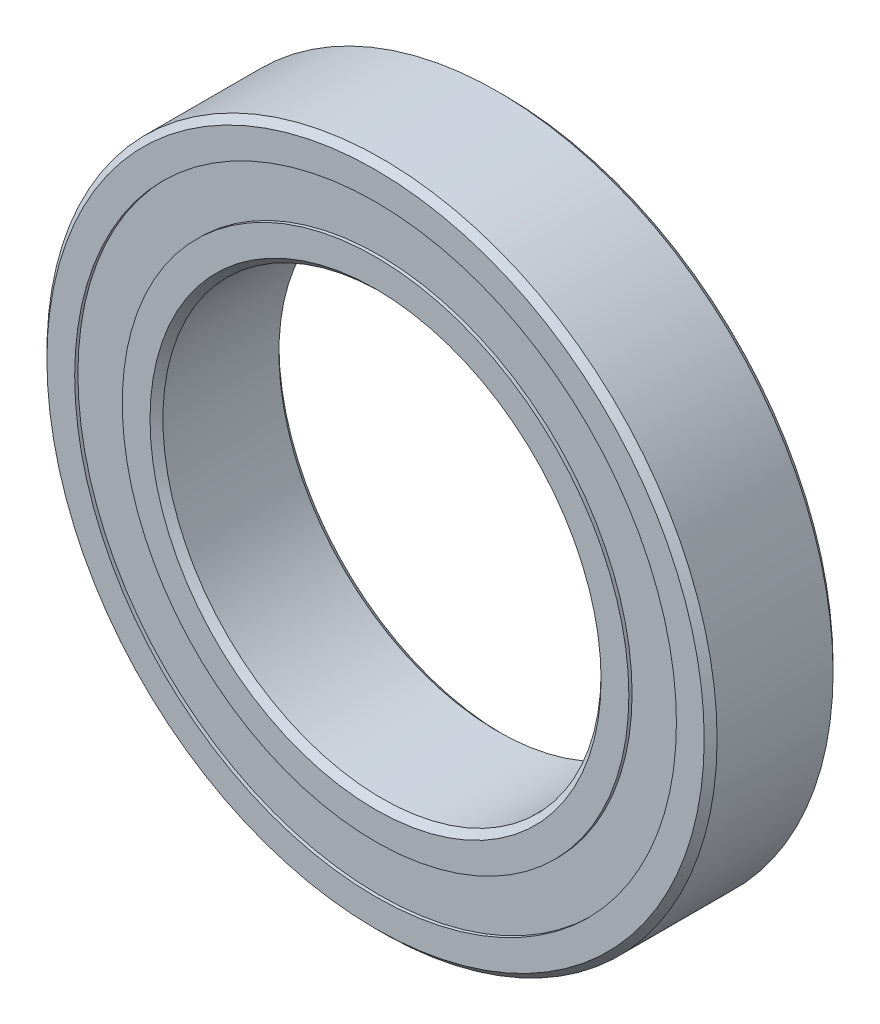
ISO-10303-21;
HEADER;
FILE_DESCRIPTION(('STEP AP214'),'2;1');
FILE_NAME('part.step','',(''),(''),'','','');
FILE_SCHEMA(('AUTOMOTIVE_DESIGN { 1 0 10303 214 1 1 1 1 }'));
ENDSEC;
DATA;
#1=APPLICATION_CONTEXT('core data for automotive mechanical design processes');
#2=APPLICATION_PROTOCOL_DEFINITION('international standard','automotive_design',2000,#1);
#3=PRODUCT_CONTEXT('',#1,'mechanical');
#4=PRODUCT('Part','Part','',(#3));
#5=PRODUCT_RELATED_PRODUCT_CATEGORY('part','',(#4));
#6=PRODUCT_DEFINITION_FORMATION('','',#4);
#7=PRODUCT_DEFINITION_CONTEXT('part definition',#1,'design');
#8=PRODUCT_DEFINITION('design','',#6,#7);
#9=PRODUCT_DEFINITION_SHAPE('','',#8);
#10=(LENGTH_UNIT() NAMED_UNIT(*) SI_UNIT(.MILLI.,.METRE.));
#11=(NAMED_UNIT(*) PLANE_ANGLE_UNIT() SI_UNIT($,.RADIAN.));
#12=(NAMED_UNIT(*) SI_UNIT($,.STERADIAN.) SOLID_ANGLE_UNIT());
#13=UNCERTAINTY_MEASURE_WITH_UNIT(LENGTH_MEASURE(1.E-05),#10,'distance_accuracy_value','');
#14=(GEOMETRIC_REPRESENTATION_CONTEXT(3) GLOBAL_UNCERTAINTY_ASSIGNED_CONTEXT((#13)) GLOBAL_UNIT_ASSIGNED_CONTEXT((#10,
#11,#12)) REPRESENTATION_CONTEXT('',''));
#15=CARTESIAN_POINT('',(0.,0.,0.));
#16=DIRECTION('',(0.,0.,1.));
#17=DIRECTION('',(1.,0.,0.));
#18=AXIS2_PLACEMENT_3D('',#15,#16,#17);
#19=CARTESIAN_POINT('',(-5.37499999999988,9.30977309068279,0.));
#20=DIRECTION('',(0.,0.,1.));
#21=DIRECTION('',(-0.499999999999989,0.866025403784445,0.));
#22=AXIS2_PLACEMENT_3D('',#19,#20,#21);
#23=SPHERICAL_SURFACE('',#22,1.44452030347508);
#24=CARTESIAN_POINT('',(-5.37499999999988,9.30977309068279,1.44452030347508));
#25=VERTEX_POINT('',#24);
#26=VERTEX_LOOP('',#25);
#27=FACE_BOUND('',#26,.T.);
#28=ADVANCED_FACE('F37',(#27),#23,.T.);
#29=CLOSED_SHELL('',(#28));
#30=MANIFOLD_SOLID_BREP('B2',#29);
#31=CARTESIAN_POINT('',(-9.30977309068265,5.37500000000011,0.));
#32=DIRECTION('',(0.,0.,1.));
#33=DIRECTION('',(-0.866025403784433,0.50000000000001,0.));
#34=AXIS2_PLACEMENT_3D('',#31,#32,#33);
#35=SPHERICAL_SURFACE('',#34,1.44452030347508);
#36=CARTESIAN_POINT('',(-9.30977309068265,5.37500000000011,1.44452030347508));
#37=VERTEX_POINT('',#36);
#38=VERTEX_LOOP('',#37);
#39=FACE_BOUND('',#38,.T.);
#40=ADVANCED_FACE('F57',(#39),#35,.T.);
#41=CLOSED_SHELL('',(#40));
#42=MANIFOLD_SOLID_BREP('B6',#41);
#43=CARTESIAN_POINT('',(-10.75,1.12600273177691E-13,0.));
#44=DIRECTION('',(0.,0.,1.));
#45=DIRECTION('',(-1.,0.,0.));
#46=AXIS2_PLACEMENT_3D('',#43,#44,#45);
#47=SPHERICAL_SURFACE('',#46,1.44452030347508);
#48=CARTESIAN_POINT('',(-10.75,1.12600273177691E-13,1.44452030347508));
#49=VERTEX_POINT('',#48);
#50=VERTEX_LOOP('',#49);
#51=FACE_BOUND('',#50,.T.);
#52=ADVANCED_FACE('F77',(#51),#47,.T.);
#53=CLOSED_SHELL('',(#52));
#54=MANIFOLD_SOLID_BREP('B33',#53);
#55=CARTESIAN_POINT('',(-9.30977309068277,-5.37499999999991,0.));
#56=DIRECTION('',(0.,0.,1.));
#57=DIRECTION('',(-0.866025403784443,-0.499999999999992,0.));
#58=AXIS2_PLACEMENT_3D('',#55,#56,#57);
#59=SPHERICAL_SURFACE('',#58,1.44452030347508);
#60=CARTESIAN_POINT('',(-9.30977309068277,-5.37499999999991,1.44452030347508));
#61=VERTEX_POINT('',#60);
#62=VERTEX_LOOP('',#61);
#63=FACE_BOUND('',#62,.T.);
#64=ADVANCED_FACE('F97',(#63),#59,.T.);
#65=CLOSED_SHELL('',(#64));
#66=MANIFOLD_SOLID_BREP('B53',#65);
#67=CARTESIAN_POINT('',(-5.37500000000008,-9.30977309068267,0.));
#68=DIRECTION('',(0.,0.,1.));
#69=DIRECTION('',(-0.500000000000007,-0.866025403784435,0.));
#70=AXIS2_PLACEMENT_3D('',#67,#68,#69);
#71=SPHERICAL_SURFACE('',#70,1.44452030347508);
#72=CARTESIAN_POINT('',(-5.37500000000008,-9.30977309068267,1.44452030347508));
#73=VERTEX_POINT('',#72);
#74=VERTEX_LOOP('',#73);
#75=FACE_BOUND('',#74,.T.);
#76=ADVANCED_FACE('F117',(#75),#71,.T.);
#77=CLOSED_SHELL('',(#76));
#78=MANIFOLD_SOLID_BREP('B73',#77);
#79=CARTESIAN_POINT('',(0.,-10.75,0.));
#80=DIRECTION('',(0.,0.,1.));
#81=DIRECTION('',(0.,-1.,0.));
#82=AXIS2_PLACEMENT_3D('',#79,#80,#81);
#83=SPHERICAL_SURFACE('',#82,1.44452030347508);
#84=CARTESIAN_POINT('',(0.,-10.75,1.44452030347508));
#85=VERTEX_POINT('',#84);
#86=VERTEX_LOOP('',#85);
#87=FACE_BOUND('',#86,.T.);
#88=ADVANCED_FACE('F137',(#87),#83,.T.);
#89=CLOSED_SHELL('',(#88));
#90=MANIFOLD_SOLID_BREP('B93',#89);
#91=CARTESIAN_POINT('',(5.37499999999995,-9.30977309068275,0.));
#92=DIRECTION('',(0.,0.,1.));
#93=DIRECTION('',(0.499999999999995,-0.866025403784442,0.));
#94=AXIS2_PLACEMENT_3D('',#91,#92,#93);
#95=SPHERICAL_SURFACE('',#94,1.44452030347508);
#96=CARTESIAN_POINT('',(5.37499999999995,-9.30977309068275,1.44452030347508));
#97=VERTEX_POINT('',#96);
#98=VERTEX_LOOP('',#97);
#99=FACE_BOUND('',#98,.T.);
#100=ADVANCED_FACE('F157',(#99),#95,.T.);
#101=CLOSED_SHELL('',(#100));
#102=MANIFOLD_SOLID_BREP('B113',#101);
#103=CARTESIAN_POINT('',(9.30977309068269,-5.37500000000005,0.));
#104=DIRECTION('',(0.,0.,1.));
#105=DIRECTION('',(0.866025403784436,-0.500000000000004,0.));
#106=AXIS2_PLACEMENT_3D('',#103,#104,#105);
#107=SPHERICAL_SURFACE('',#106,1.44452030347508);
#108=CARTESIAN_POINT('',(9.30977309068269,-5.37500000000005,1.44452030347508));
#109=VERTEX_POINT('',#108);
#110=VERTEX_LOOP('',#109);
#111=FACE_BOUND('',#110,.T.);
#112=ADVANCED_FACE('F177',(#111),#107,.T.);
#113=CLOSED_SHELL('',(#112));
#114=MANIFOLD_SOLID_BREP('B133',#113);
#115=CARTESIAN_POINT('',(10.75,0.,0.));
#116=DIRECTION('',(0.,0.,1.));
#117=DIRECTION('',(1.,0.,0.));
#118=AXIS2_PLACEMENT_3D('',#115,#116,#117);
#119=SPHERICAL_SURFACE('',#118,1.44452030347508);
#120=CARTESIAN_POINT('',(10.75,0.,1.44452030347508));
#121=VERTEX_POINT('',#120);
#122=VERTEX_LOOP('',#121);
#123=FACE_BOUND('',#122,.T.);
#124=ADVANCED_FACE('F197',(#123),#119,.T.);
#125=CLOSED_SHELL('',(#124));
#126=MANIFOLD_SOLID_BREP('B153',#125);
#127=CARTESIAN_POINT('',(9.30977309068273,5.37499999999998,0.));
#128=DIRECTION('',(0.,0.,1.));
#129=DIRECTION('',(0.86602540378444,0.499999999999998,0.));
#130=AXIS2_PLACEMENT_3D('',#127,#128,#129);
#131=SPHERICAL_SURFACE('',#130,1.44452030347508);
#132=CARTESIAN_POINT('',(9.30977309068273,5.37499999999998,1.44452030347508));
#133=VERTEX_POINT('',#132);
#134=VERTEX_LOOP('',#133);
#135=FACE_BOUND('',#134,.T.);
#136=ADVANCED_FACE('F217',(#135),#131,.T.);
#137=CLOSED_SHELL('',(#136));
#138=MANIFOLD_SOLID_BREP('B173',#137);
#139=CARTESIAN_POINT('',(5.37500000000001,9.30977309068271,0.));
#140=DIRECTION('',(0.,0.,1.));
#141=DIRECTION('',(0.500000000000001,0.866025403784438,0.));
#142=AXIS2_PLACEMENT_3D('',#139,#140,#141);
#143=SPHERICAL_SURFACE('',#142,1.44452030347508);
#144=CARTESIAN_POINT('',(5.37500000000001,9.30977309068271,1.44452030347508));
#145=VERTEX_POINT('',#144);
#146=VERTEX_LOOP('',#145);
#147=FACE_BOUND('',#146,.T.);
#148=ADVANCED_FACE('F237',(#147),#143,.T.);
#149=CLOSED_SHELL('',(#148));
#150=MANIFOLD_SOLID_BREP('B193',#149);
#151=CARTESIAN_POINT('',(0.,10.75,0.));
#152=DIRECTION('',(0.,0.,1.));
#153=DIRECTION('',(0.,1.,0.));
#154=AXIS2_PLACEMENT_3D('',#151,#152,#153);
#155=SPHERICAL_SURFACE('',#154,1.44452030347508);
#156=CARTESIAN_POINT('',(0.,10.75,1.44452030347508));
#157=VERTEX_POINT('',#156);
#158=VERTEX_LOOP('',#157);
#159=FACE_BOUND('',#158,.T.);
#160=ADVANCED_FACE('F258',(#159),#155,.T.);
#161=CLOSED_SHELL('',(#160));
#162=MANIFOLD_SOLID_BREP('B213',#161);
#163=CARTESIAN_POINT('',(0.,0.,2.5));
#164=DIRECTION('',(0.,0.,1.));
#165=DIRECTION('',(1.,0.,0.));
#166=AXIS2_PLACEMENT_3D('',#163,#164,#165);
#167=CYLINDRICAL_SURFACE('',#166,11.6730769230769);
#168=CARTESIAN_POINT('',(0.,0.,-2.5));
#169=DIRECTION('',(0.,0.,1.));
#170=DIRECTION('',(1.,0.,0.));
#171=AXIS2_PLACEMENT_3D('',#168,#169,#170);
#172=CIRCLE('',#171,11.6730769230769);
#173=CARTESIAN_POINT('',(11.6730769230769,0.,-2.5));
#174=VERTEX_POINT('',#173);
#175=EDGE_CURVE('E310',#174,#174,#172,.T.);
#176=ORIENTED_EDGE('',*,*,#175,.F.);
#177=EDGE_LOOP('',(#176));
#178=FACE_BOUND('',#177,.T.);
#179=CARTESIAN_POINT('',(0.,0.,-2.375));
#180=DIRECTION('',(0.,0.,1.));
#181=DIRECTION('',(1.,0.,0.));
#182=AXIS2_PLACEMENT_3D('',#179,#180,#181);
#183=CIRCLE('',#182,11.6730769230769);
#184=CARTESIAN_POINT('',(11.6730769230769,0.,-2.375));
#185=VERTEX_POINT('',#184);
#186=EDGE_CURVE('E257',#185,#185,#183,.F.);
#187=ORIENTED_EDGE('',*,*,#186,.F.);
#188=EDGE_LOOP('',(#187));
#189=FACE_BOUND('',#188,.T.);
#190=ADVANCED_FACE('F271',(#178,#189),#167,.F.);
#191=CARTESIAN_POINT('',(0.,0.,2.5));
#192=DIRECTION('',(0.,0.,1.));
#193=DIRECTION('',(1.,0.,0.));
#194=AXIS2_PLACEMENT_3D('',#191,#192,#193);
#195=CYLINDRICAL_SURFACE('',#194,9.82692307692308);
#196=CARTESIAN_POINT('',(0.,0.,-2.5));
#197=DIRECTION('',(0.,0.,1.));
#198=DIRECTION('',(1.,0.,0.));
#199=AXIS2_PLACEMENT_3D('',#196,#197,#198);
#200=CIRCLE('',#199,9.82692307692308);
#201=CARTESIAN_POINT('',(9.82692307692308,0.,-2.5));
#202=VERTEX_POINT('',#201);
#203=EDGE_CURVE('E337',#202,#202,#200,.T.);
#204=ORIENTED_EDGE('',*,*,#203,.T.);
#205=EDGE_LOOP('',(#204));
#206=FACE_BOUND('',#205,.T.);
#207=CARTESIAN_POINT('',(0.,0.,-2.375));
#208=DIRECTION('',(0.,0.,1.));
#209=DIRECTION('',(1.,0.,0.));
#210=AXIS2_PLACEMENT_3D('',#207,#208,#209);
#211=CIRCLE('',#210,9.82692307692308);
#212=CARTESIAN_POINT('',(9.82692307692308,0.,-2.375));
#213=VERTEX_POINT('',#212);
#214=EDGE_CURVE('E283',#213,#213,#211,.T.);
#215=ORIENTED_EDGE('',*,*,#214,.F.);
#216=EDGE_LOOP('',(#215));
#217=FACE_BOUND('',#216,.T.);
#218=ADVANCED_FACE('F379',(#206,#217),#195,.T.);
#219=CARTESIAN_POINT('',(0.,0.,2.5));
#220=DIRECTION('',(0.,0.,1.));
#221=DIRECTION('',(1.,0.,0.));
#222=AXIS2_PLACEMENT_3D('',#219,#220,#221);
#223=CYLINDRICAL_SURFACE('',#222,11.6730769230769);
#224=CARTESIAN_POINT('',(0.,0.,2.5));
#225=DIRECTION('',(0.,0.,1.));
#226=DIRECTION('',(1.,0.,0.));
#227=AXIS2_PLACEMENT_3D('',#224,#225,#226);
#228=CIRCLE('',#227,11.6730769230769);
#229=CARTESIAN_POINT('',(11.6730769230769,0.,2.5));
#230=VERTEX_POINT('',#229);
#231=EDGE_CURVE('E301',#230,#230,#228,.T.);
#232=ORIENTED_EDGE('',*,*,#231,.T.);
#233=EDGE_LOOP('',(#232));
#234=FACE_BOUND('',#233,.T.);
#235=CARTESIAN_POINT('',(0.,0.,2.375));
#236=DIRECTION('',(0.,0.,-1.));
#237=DIRECTION('',(-1.,0.,0.));
#238=AXIS2_PLACEMENT_3D('',#235,#236,#237);
#239=CIRCLE('',#238,11.6730769230769);
#240=CARTESIAN_POINT('',(-11.6730769230769,0.,2.375));
#241=VERTEX_POINT('',#240);
#242=EDGE_CURVE('E292',#241,#241,#239,.F.);
#243=ORIENTED_EDGE('',*,*,#242,.F.);
#244=EDGE_LOOP('',(#243));
#245=FACE_BOUND('',#244,.T.);
#246=ADVANCED_FACE('F377',(#234,#245),#223,.F.);
#247=CARTESIAN_POINT('',(0.,0.,2.25));
#248=DIRECTION('',(0.,0.,-1.));
#249=DIRECTION('',(-1.,0.,0.));
#250=AXIS2_PLACEMENT_3D('',#247,#248,#249);
#251=CONICAL_SURFACE('',#250,13.,0.785398163397431);
#252=CARTESIAN_POINT('',(0.,0.,2.5));
#253=DIRECTION('',(0.,0.,1.));
#254=DIRECTION('',(1.,0.,0.));
#255=AXIS2_PLACEMENT_3D('',#252,#253,#254);
#256=CIRCLE('',#255,12.75);
#257=CARTESIAN_POINT('',(12.75,0.,2.5));
#258=VERTEX_POINT('',#257);
#259=EDGE_CURVE('E298',#258,#258,#256,.T.);
#260=ORIENTED_EDGE('',*,*,#259,.F.);
#261=EDGE_LOOP('',(#260));
#262=FACE_BOUND('',#261,.T.);
#263=CARTESIAN_POINT('',(0.,0.,2.25));
#264=DIRECTION('',(0.,0.,1.));
#265=DIRECTION('',(1.,0.,0.));
#266=AXIS2_PLACEMENT_3D('',#263,#264,#265);
#267=CIRCLE('',#266,13.);
#268=CARTESIAN_POINT('',(13.,0.,2.25));
#269=VERTEX_POINT('',#268);
#270=EDGE_CURVE('E319',#269,#269,#267,.T.);
#271=ORIENTED_EDGE('',*,*,#270,.T.);
#272=EDGE_LOOP('',(#271));
#273=FACE_BOUND('',#272,.T.);
#274=ADVANCED_FACE('F273',(#262,#273),#251,.T.);
#275=CARTESIAN_POINT('',(0.,12.75,2.5));
#276=DIRECTION('',(0.,0.,-1.));
#277=DIRECTION('',(-1.,0.,0.));
#278=AXIS2_PLACEMENT_3D('',#275,#276,#277);
#279=PLANE('',#278);
#280=ORIENTED_EDGE('',*,*,#231,.F.);
#281=EDGE_LOOP('',(#280));
#282=FACE_BOUND('',#281,.T.);
#283=ORIENTED_EDGE('',*,*,#259,.T.);
#284=EDGE_LOOP('',(#283));
#285=FACE_BOUND('',#284,.T.);
#286=ADVANCED_FACE('F387',(#282,#285),#279,.F.);
#287=CARTESIAN_POINT('',(0.,12.75,-2.5));
#288=DIRECTION('',(0.,0.,1.));
#289=DIRECTION('',(1.,0.,0.));
#290=AXIS2_PLACEMENT_3D('',#287,#288,#289);
#291=PLANE('',#290);
#292=CARTESIAN_POINT('',(0.,0.,-2.5));
#293=DIRECTION('',(0.,0.,1.));
#294=DIRECTION('',(1.,0.,0.));
#295=AXIS2_PLACEMENT_3D('',#292,#293,#294);
#296=CIRCLE('',#295,12.75);
#297=CARTESIAN_POINT('',(12.75,0.,-2.5));
#298=VERTEX_POINT('',#297);
#299=EDGE_CURVE('E313',#298,#298,#296,.T.);
#300=ORIENTED_EDGE('',*,*,#299,.F.);
#301=EDGE_LOOP('',(#300));
#302=FACE_BOUND('',#301,.T.);
#303=ORIENTED_EDGE('',*,*,#175,.T.);
#304=EDGE_LOOP('',(#303));
#305=FACE_BOUND('',#304,.T.);
#306=ADVANCED_FACE('F449',(#302,#305),#291,.F.);
#307=CARTESIAN_POINT('',(0.,0.,-2.5));
#308=DIRECTION('',(0.,0.,1.));
#309=DIRECTION('',(1.,0.,0.));
#310=AXIS2_PLACEMENT_3D('',#307,#308,#309);
#311=CONICAL_SURFACE('',#310,12.75,0.785398163397459);
#312=CARTESIAN_POINT('',(0.,0.,-2.25));
#313=DIRECTION('',(0.,0.,1.));
#314=DIRECTION('',(1.,0.,0.));
#315=AXIS2_PLACEMENT_3D('',#312,#313,#314);
#316=CIRCLE('',#315,13.);
#317=CARTESIAN_POINT('',(13.,0.,-2.25));
#318=VERTEX_POINT('',#317);
#319=EDGE_CURVE('E316',#318,#318,#316,.T.);
#320=ORIENTED_EDGE('',*,*,#319,.F.);
#321=EDGE_LOOP('',(#320));
#322=FACE_BOUND('',#321,.T.);
#323=ORIENTED_EDGE('',*,*,#299,.T.);
#324=EDGE_LOOP('',(#323));
#325=FACE_BOUND('',#324,.T.);
#326=ADVANCED_FACE('F446',(#322,#325),#311,.T.);
#327=CARTESIAN_POINT('',(0.,0.,2.5));
#328=DIRECTION('',(0.,0.,1.));
#329=DIRECTION('',(1.,0.,0.));
#330=AXIS2_PLACEMENT_3D('',#327,#328,#329);
#331=CYLINDRICAL_SURFACE('',#330,13.);
#332=ORIENTED_EDGE('',*,*,#270,.F.);
#333=EDGE_LOOP('',(#332));
#334=FACE_BOUND('',#333,.T.);
#335=ORIENTED_EDGE('',*,*,#319,.T.);
#336=EDGE_LOOP('',(#335));
#337=FACE_BOUND('',#336,.T.);
#338=ADVANCED_FACE('F373',(#334,#337),#331,.T.);
#339=CARTESIAN_POINT('',(0.,11.6730769230769,2.375));
#340=DIRECTION('',(0.,0.,-1.));
#341=DIRECTION('',(-1.,0.,0.));
#342=AXIS2_PLACEMENT_3D('',#339,#340,#341);
#343=PLANE('',#342);
#344=CARTESIAN_POINT('',(0.,0.,2.375));
#345=DIRECTION('',(0.,0.,1.));
#346=DIRECTION('',(1.,0.,0.));
#347=AXIS2_PLACEMENT_3D('',#344,#345,#346);
#348=CIRCLE('',#347,9.82692307692308);
#349=CARTESIAN_POINT('',(9.82692307692308,0.,2.375));
#350=VERTEX_POINT('',#349);
#351=EDGE_CURVE('E322',#350,#350,#348,.T.);
#352=ORIENTED_EDGE('',*,*,#351,.F.);
#353=EDGE_LOOP('',(#352));
#354=FACE_BOUND('',#353,.T.);
#355=ORIENTED_EDGE('',*,*,#242,.T.);
#356=EDGE_LOOP('',(#355));
#357=FACE_BOUND('',#356,.T.);
#358=ADVANCED_FACE('F366',(#354,#357),#343,.F.);
#359=CARTESIAN_POINT('',(0.,0.,2.5));
#360=DIRECTION('',(0.,0.,1.));
#361=DIRECTION('',(1.,0.,0.));
#362=AXIS2_PLACEMENT_3D('',#359,#360,#361);
#363=CYLINDRICAL_SURFACE('',#362,9.82692307692308);
#364=CARTESIAN_POINT('',(0.,0.,2.5));
#365=DIRECTION('',(0.,0.,1.));
#366=DIRECTION('',(1.,0.,0.));
#367=AXIS2_PLACEMENT_3D('',#364,#365,#366);
#368=CIRCLE('',#367,9.82692307692308);
#369=CARTESIAN_POINT('',(9.82692307692308,0.,2.5));
#370=VERTEX_POINT('',#369);
#371=EDGE_CURVE('E346',#370,#370,#368,.T.);
#372=ORIENTED_EDGE('',*,*,#371,.F.);
#373=EDGE_LOOP('',(#372));
#374=FACE_BOUND('',#373,.T.);
#375=ORIENTED_EDGE('',*,*,#351,.T.);
#376=EDGE_LOOP('',(#375));
#377=FACE_BOUND('',#376,.T.);
#378=ADVANCED_FACE('F363',(#374,#377),#363,.T.);
#379=CARTESIAN_POINT('',(0.,0.,2.5));
#380=DIRECTION('',(0.,0.,1.));
#381=DIRECTION('',(1.,0.,0.));
#382=AXIS2_PLACEMENT_3D('',#379,#380,#381);
#383=CONICAL_SURFACE('',#382,8.75000000000001,0.785398163397462);
#384=CARTESIAN_POINT('',(0.,0.,2.25));
#385=DIRECTION('',(0.,0.,1.));
#386=DIRECTION('',(1.,0.,0.));
#387=AXIS2_PLACEMENT_3D('',#384,#385,#386);
#388=CIRCLE('',#387,8.50000000000001);
#389=CARTESIAN_POINT('',(8.50000000000001,0.,2.25));
#390=VERTEX_POINT('',#389);
#391=EDGE_CURVE('E328',#390,#390,#388,.T.);
#392=ORIENTED_EDGE('',*,*,#391,.F.);
#393=EDGE_LOOP('',(#392));
#394=FACE_BOUND('',#393,.T.);
#395=CARTESIAN_POINT('',(0.,0.,2.5));
#396=DIRECTION('',(0.,0.,1.));
#397=DIRECTION('',(1.,0.,0.));
#398=AXIS2_PLACEMENT_3D('',#395,#396,#397);
#399=CIRCLE('',#398,8.75000000000001);
#400=CARTESIAN_POINT('',(8.75000000000001,0.,2.5));
#401=VERTEX_POINT('',#400);
#402=EDGE_CURVE('E349',#401,#401,#399,.T.);
#403=ORIENTED_EDGE('',*,*,#402,.T.);
#404=EDGE_LOOP('',(#403));
#405=FACE_BOUND('',#404,.T.);
#406=ADVANCED_FACE('F353',(#394,#405),#383,.F.);
#407=CARTESIAN_POINT('',(0.,0.,2.5));
#408=DIRECTION('',(0.,0.,1.));
#409=DIRECTION('',(1.,0.,0.));
#410=AXIS2_PLACEMENT_3D('',#407,#408,#409);
#411=CYLINDRICAL_SURFACE('',#410,8.50000000000001);
#412=CARTESIAN_POINT('',(0.,0.,-2.25));
#413=DIRECTION('',(0.,0.,1.));
#414=DIRECTION('',(1.,0.,0.));
#415=AXIS2_PLACEMENT_3D('',#412,#413,#414);
#416=CIRCLE('',#415,8.50000000000001);
#417=CARTESIAN_POINT('',(8.50000000000001,0.,-2.25));
#418=VERTEX_POINT('',#417);
#419=EDGE_CURVE('E331',#418,#418,#416,.T.);
#420=ORIENTED_EDGE('',*,*,#419,.F.);
#421=EDGE_LOOP('',(#420));
#422=FACE_BOUND('',#421,.T.);
#423=ORIENTED_EDGE('',*,*,#391,.T.);
#424=EDGE_LOOP('',(#423));
#425=FACE_BOUND('',#424,.T.);
#426=ADVANCED_FACE('F436',(#422,#425),#411,.F.);
#427=CARTESIAN_POINT('',(0.,0.,-2.25));
#428=DIRECTION('',(0.,0.,-1.));
#429=DIRECTION('',(-1.,0.,0.));
#430=AXIS2_PLACEMENT_3D('',#427,#428,#429);
#431=CONICAL_SURFACE('',#430,8.50000000000001,0.785398163397462);
#432=CARTESIAN_POINT('',(0.,0.,-2.5));
#433=DIRECTION('',(0.,0.,1.));
#434=DIRECTION('',(1.,0.,0.));
#435=AXIS2_PLACEMENT_3D('',#432,#433,#434);
#436=CIRCLE('',#435,8.75000000000001);
#437=CARTESIAN_POINT('',(8.75000000000001,0.,-2.5));
#438=VERTEX_POINT('',#437);
#439=EDGE_CURVE('E334',#438,#438,#436,.T.);
#440=ORIENTED_EDGE('',*,*,#439,.F.);
#441=EDGE_LOOP('',(#440));
#442=FACE_BOUND('',#441,.T.);
#443=ORIENTED_EDGE('',*,*,#419,.T.);
#444=EDGE_LOOP('',(#443));
#445=FACE_BOUND('',#444,.T.);
#446=ADVANCED_FACE('F432',(#442,#445),#431,.F.);
#447=CARTESIAN_POINT('',(0.,8.75000000000001,-2.5));
#448=DIRECTION('',(0.,0.,1.));
#449=DIRECTION('',(1.,0.,0.));
#450=AXIS2_PLACEMENT_3D('',#447,#448,#449);
#451=PLANE('',#450);
#452=ORIENTED_EDGE('',*,*,#203,.F.);
#453=EDGE_LOOP('',(#452));
#454=FACE_BOUND('',#453,.T.);
#455=ORIENTED_EDGE('',*,*,#439,.T.);
#456=EDGE_LOOP('',(#455));
#457=FACE_BOUND('',#456,.T.);
#458=ADVANCED_FACE('F359',(#454,#457),#451,.F.);
#459=CARTESIAN_POINT('',(0.,8.75000000000001,2.5));
#460=DIRECTION('',(0.,0.,-1.));
#461=DIRECTION('',(-1.,0.,0.));
#462=AXIS2_PLACEMENT_3D('',#459,#460,#461);
#463=PLANE('',#462);
#464=ORIENTED_EDGE('',*,*,#402,.F.);
#465=EDGE_LOOP('',(#464));
#466=FACE_BOUND('',#465,.T.);
#467=ORIENTED_EDGE('',*,*,#371,.T.);
#468=EDGE_LOOP('',(#467));
#469=FACE_BOUND('',#468,.T.);
#470=ADVANCED_FACE('F355',(#466,#469),#463,.F.);
#471=CARTESIAN_POINT('',(0.,11.6730769230769,-2.375));
#472=DIRECTION('',(0.,0.,1.));
#473=DIRECTION('',(1.,0.,0.));
#474=AXIS2_PLACEMENT_3D('',#471,#472,#473);
#475=PLANE('',#474);
#476=ORIENTED_EDGE('',*,*,#186,.T.);
#477=EDGE_LOOP('',(#476));
#478=FACE_BOUND('',#477,.T.);
#479=ORIENTED_EDGE('',*,*,#214,.T.);
#480=EDGE_LOOP('',(#479));
#481=FACE_BOUND('',#480,.T.);
#482=ADVANCED_FACE('F358',(#478,#481),#475,.F.);
#483=CLOSED_SHELL('',(#190,#218,#246,#274,#286,#306,#326,#338,#358,#378,#406,#426,#446,#458,
#470,#482));
#484=CARTESIAN_POINT('',(0.,11.6730769230769,-1.44452030347508));
#485=DIRECTION('',(0.,0.,-1.));
#486=DIRECTION('',(-1.,0.,0.));
#487=AXIS2_PLACEMENT_3D('',#484,#485,#486);
#488=PLANE('',#487);
#489=CARTESIAN_POINT('',(0.,0.,-1.44452030347508));
#490=DIRECTION('',(0.,0.,-1.));
#491=DIRECTION('',(-1.,0.,0.));
#492=AXIS2_PLACEMENT_3D('',#489,#490,#491);
#493=CIRCLE('',#492,9.82692307692308);
#494=CARTESIAN_POINT('',(-9.82692307692308,0.,-1.44452030347508));
#495=VERTEX_POINT('',#494);
#496=EDGE_CURVE('E287',#495,#495,#493,.T.);
#497=ORIENTED_EDGE('',*,*,#496,.T.);
#498=EDGE_LOOP('',(#497));
#499=FACE_BOUND('',#498,.T.);
#500=CARTESIAN_POINT('',(0.,0.,-1.44452030347508));
#501=DIRECTION('',(0.,0.,-1.));
#502=DIRECTION('',(-1.,0.,0.));
#503=AXIS2_PLACEMENT_3D('',#500,#501,#502);
#504=CIRCLE('',#503,11.6730769230769);
#505=CARTESIAN_POINT('',(-11.6730769230769,0.,-1.44452030347508));
#506=VERTEX_POINT('',#505);
#507=EDGE_CURVE('E279',#506,#506,#504,.F.);
#508=ORIENTED_EDGE('',*,*,#507,.T.);
#509=EDGE_LOOP('',(#508));
#510=FACE_BOUND('',#509,.T.);
#511=ADVANCED_FACE('F395',(#499,#510),#488,.F.);
#512=CARTESIAN_POINT('',(0.,0.,1.11111111111111));
#513=DIRECTION('',(0.,0.,1.));
#514=DIRECTION('',(1.,0.,0.));
#515=AXIS2_PLACEMENT_3D('',#512,#513,#514);
#516=CIRCLE('',#515,11.6730769230769);
#517=CARTESIAN_POINT('',(11.6730769230769,0.,1.11111111111111));
#518=VERTEX_POINT('',#517);
#519=EDGE_CURVE('E304',#518,#518,#516,.T.);
#520=ORIENTED_EDGE('',*,*,#519,.F.);
#521=EDGE_LOOP('',(#520));
#522=FACE_BOUND('',#521,.T.);
#523=CARTESIAN_POINT('',(0.,0.,1.44452030347508));
#524=DIRECTION('',(0.,0.,1.));
#525=DIRECTION('',(1.,0.,0.));
#526=AXIS2_PLACEMENT_3D('',#523,#524,#525);
#527=CIRCLE('',#526,11.6730769230769);
#528=CARTESIAN_POINT('',(11.6730769230769,0.,1.44452030347508));
#529=VERTEX_POINT('',#528);
#530=EDGE_CURVE('E295',#529,#529,#527,.F.);
#531=ORIENTED_EDGE('',*,*,#530,.F.);
#532=EDGE_LOOP('',(#531));
#533=FACE_BOUND('',#532,.T.);
#534=ADVANCED_FACE('F382',(#522,#533),#223,.F.);
#535=CARTESIAN_POINT('',(0.,0.,0.));
#536=DIRECTION('',(0.,0.,1.));
#537=DIRECTION('',(1.,0.,0.));
#538=AXIS2_PLACEMENT_3D('',#535,#536,#537);
#539=TOROIDAL_SURFACE('',#538,10.75,1.44452030347508);
#540=CARTESIAN_POINT('',(0.,0.,-1.11111111111111));
#541=DIRECTION('',(0.,0.,1.));
#542=DIRECTION('',(1.,0.,0.));
#543=AXIS2_PLACEMENT_3D('',#540,#541,#542);
#544=CIRCLE('',#543,11.6730769230769);
#545=CARTESIAN_POINT('',(11.6730769230769,0.,-1.11111111111111));
#546=VERTEX_POINT('',#545);
#547=EDGE_CURVE('E307',#546,#546,#544,.T.);
#548=ORIENTED_EDGE('',*,*,#547,.F.);
#549=EDGE_LOOP('',(#548));
#550=FACE_BOUND('',#549,.T.);
#551=ORIENTED_EDGE('',*,*,#519,.T.);
#552=EDGE_LOOP('',(#551));
#553=FACE_BOUND('',#552,.T.);
#554=ADVANCED_FACE('F394',(#550,#553),#539,.F.);
#555=ORIENTED_EDGE('',*,*,#547,.T.);
#556=EDGE_LOOP('',(#555));
#557=FACE_BOUND('',#556,.T.);
#558=ORIENTED_EDGE('',*,*,#507,.F.);
#559=EDGE_LOOP('',(#558));
#560=FACE_BOUND('',#559,.T.);
#561=ADVANCED_FACE('F401',(#557,#560),#167,.F.);
#562=CARTESIAN_POINT('',(0.,11.6730769230769,1.44452030347508));
#563=DIRECTION('',(0.,0.,1.));
#564=DIRECTION('',(1.,0.,0.));
#565=AXIS2_PLACEMENT_3D('',#562,#563,#564);
#566=PLANE('',#565);
#567=ORIENTED_EDGE('',*,*,#530,.T.);
#568=EDGE_LOOP('',(#567));
#569=FACE_BOUND('',#568,.T.);
#570=CARTESIAN_POINT('',(0.,0.,1.44452030347508));
#571=DIRECTION('',(0.,0.,1.));
#572=DIRECTION('',(1.,0.,0.));
#573=AXIS2_PLACEMENT_3D('',#570,#571,#572);
#574=CIRCLE('',#573,9.82692307692308);
#575=CARTESIAN_POINT('',(9.82692307692308,0.,1.44452030347508));
#576=VERTEX_POINT('',#575);
#577=EDGE_CURVE('E325',#576,#576,#574,.F.);
#578=ORIENTED_EDGE('',*,*,#577,.F.);
#579=EDGE_LOOP('',(#578));
#580=FACE_BOUND('',#579,.T.);
#581=ADVANCED_FACE('F408',(#569,#580),#566,.F.);
#582=CARTESIAN_POINT('',(0.,0.,1.11111111111111));
#583=DIRECTION('',(0.,0.,1.));
#584=DIRECTION('',(1.,0.,0.));
#585=AXIS2_PLACEMENT_3D('',#582,#583,#584);
#586=CIRCLE('',#585,9.82692307692308);
#587=CARTESIAN_POINT('',(9.82692307692308,0.,1.11111111111111));
#588=VERTEX_POINT('',#587);
#589=EDGE_CURVE('E343',#588,#588,#586,.T.);
#590=ORIENTED_EDGE('',*,*,#589,.T.);
#591=EDGE_LOOP('',(#590));
#592=FACE_BOUND('',#591,.T.);
#593=ORIENTED_EDGE('',*,*,#577,.T.);
#594=EDGE_LOOP('',(#593));
#595=FACE_BOUND('',#594,.T.);
#596=ADVANCED_FACE('F368',(#592,#595),#363,.T.);
#597=CARTESIAN_POINT('',(0.,0.,0.));
#598=DIRECTION('',(0.,0.,1.));
#599=DIRECTION('',(1.,0.,0.));
#600=AXIS2_PLACEMENT_3D('',#597,#598,#599);
#601=TOROIDAL_SURFACE('',#600,10.75,1.44452030347508);
#602=ORIENTED_EDGE('',*,*,#589,.F.);
#603=EDGE_LOOP('',(#602));
#604=FACE_BOUND('',#603,.T.);
#605=CARTESIAN_POINT('',(0.,0.,-1.11111111111111));
#606=DIRECTION('',(0.,0.,1.));
#607=DIRECTION('',(1.,0.,0.));
#608=AXIS2_PLACEMENT_3D('',#605,#606,#607);
#609=CIRCLE('',#608,9.82692307692308);
#610=CARTESIAN_POINT('',(9.82692307692308,0.,-1.11111111111111));
#611=VERTEX_POINT('',#610);
#612=EDGE_CURVE('E340',#611,#611,#609,.T.);
#613=ORIENTED_EDGE('',*,*,#612,.T.);
#614=EDGE_LOOP('',(#613));
#615=FACE_BOUND('',#614,.T.);
#616=ADVANCED_FACE('F426',(#604,#615),#601,.F.);
#617=ORIENTED_EDGE('',*,*,#612,.F.);
#618=EDGE_LOOP('',(#617));
#619=FACE_BOUND('',#618,.T.);
#620=ORIENTED_EDGE('',*,*,#496,.F.);
#621=EDGE_LOOP('',(#620));
#622=FACE_BOUND('',#621,.T.);
#623=ADVANCED_FACE('F391',(#619,#622),#195,.T.);
#624=CLOSED_SHELL('',(#511,#534,#554,#561,#581,#596,#616,#623));
#625=ORIENTED_CLOSED_SHELL('',*,#624,.T.);
#626=BREP_WITH_VOIDS('B233',#483,(#625));
#627=ADVANCED_BREP_SHAPE_REPRESENTATION('',(#18,#30,#42,#54,#66,#78,#90,#102,#114,#126,#138,
#150,#162,#626),#14);
#628=SHAPE_DEFINITION_REPRESENTATION(#9,#627);
ENDSEC;
END-ISO-10303-21;
